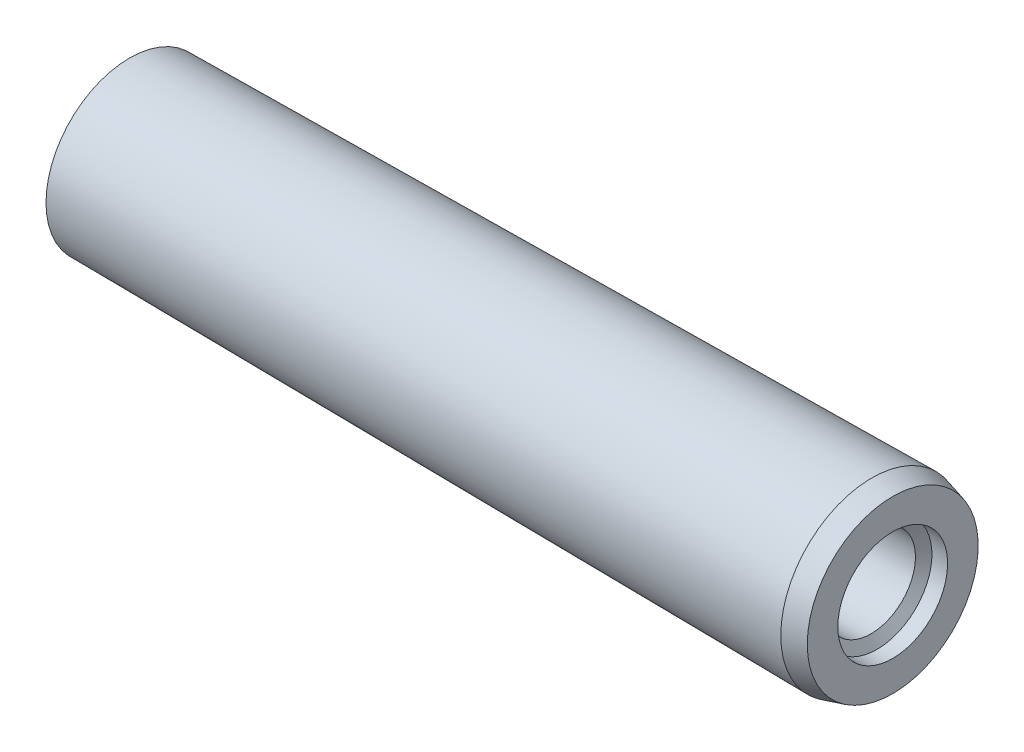
ISO-10303-21;
HEADER;
FILE_DESCRIPTION(('STEP AP214'),'2;1');
FILE_NAME('part.step','',(''),(''),'','','');
FILE_SCHEMA(('AUTOMOTIVE_DESIGN { 1 0 10303 214 1 1 1 1 }'));
ENDSEC;
DATA;
#1=APPLICATION_CONTEXT('core data for automotive mechanical design processes');
#2=APPLICATION_PROTOCOL_DEFINITION('international standard','automotive_design',2000,#1);
#3=PRODUCT_CONTEXT('',#1,'mechanical');
#4=PRODUCT('Part','Part','',(#3));
#5=PRODUCT_RELATED_PRODUCT_CATEGORY('part','',(#4));
#6=PRODUCT_DEFINITION_FORMATION('','',#4);
#7=PRODUCT_DEFINITION_CONTEXT('part definition',#1,'design');
#8=PRODUCT_DEFINITION('design','',#6,#7);
#9=PRODUCT_DEFINITION_SHAPE('','',#8);
#10=(LENGTH_UNIT() NAMED_UNIT(*) SI_UNIT(.MILLI.,.METRE.));
#11=(NAMED_UNIT(*) PLANE_ANGLE_UNIT() SI_UNIT($,.RADIAN.));
#12=(NAMED_UNIT(*) SI_UNIT($,.STERADIAN.) SOLID_ANGLE_UNIT());
#13=UNCERTAINTY_MEASURE_WITH_UNIT(LENGTH_MEASURE(1.E-05),#10,'distance_accuracy_value','');
#14=(GEOMETRIC_REPRESENTATION_CONTEXT(3) GLOBAL_UNCERTAINTY_ASSIGNED_CONTEXT((#13)) GLOBAL_UNIT_ASSIGNED_CONTEXT((#10,
#11,#12)) REPRESENTATION_CONTEXT('',''));
#15=CARTESIAN_POINT('',(0.,0.,0.));
#16=DIRECTION('',(0.,0.,1.));
#17=DIRECTION('',(1.,0.,0.));
#18=AXIS2_PLACEMENT_3D('',#15,#16,#17);
#19=CARTESIAN_POINT('',(75.,8.17410161429075,0.));
#20=DIRECTION('',(-1.,0.,0.));
#21=DIRECTION('',(0.,0.,1.));
#22=AXIS2_PLACEMENT_3D('',#19,#20,#21);
#23=PLANE('',#22);
#24=CARTESIAN_POINT('',(75.,0.,0.));
#25=DIRECTION('',(-1.,0.,0.));
#26=DIRECTION('',(0.,0.,1.));
#27=AXIS2_PLACEMENT_3D('',#24,#25,#26);
#28=CIRCLE('',#27,8.17410161429075);
#29=CARTESIAN_POINT('',(75.,0.,8.17410161429075));
#30=VERTEX_POINT('',#29);
#31=EDGE_CURVE('E11',#30,#30,#28,.T.);
#32=ORIENTED_EDGE('',*,*,#31,.F.);
#33=EDGE_LOOP('',(#32));
#34=FACE_BOUND('',#33,.T.);
#35=CARTESIAN_POINT('',(75.,0.,0.));
#36=DIRECTION('',(-1.,0.,0.));
#37=DIRECTION('',(0.,0.,1.));
#38=AXIS2_PLACEMENT_3D('',#35,#36,#37);
#39=CIRCLE('',#38,5.25);
#40=CARTESIAN_POINT('',(75.,0.,5.25));
#41=VERTEX_POINT('',#40);
#42=EDGE_CURVE('E71',#41,#41,#39,.T.);
#43=ORIENTED_EDGE('',*,*,#42,.T.);
#44=EDGE_LOOP('',(#43));
#45=FACE_BOUND('',#44,.T.);
#46=ADVANCED_FACE('F34',(#34,#45),#23,.F.);
#47=CARTESIAN_POINT('',(75.,0.,0.));
#48=DIRECTION('',(-1.,0.,0.));
#49=DIRECTION('',(0.,0.,1.));
#50=AXIS2_PLACEMENT_3D('',#47,#48,#49);
#51=CONICAL_SURFACE('',#50,8.17410161429075,0.261799387799146);
#52=CARTESIAN_POINT('',(73.,0.,0.));
#53=DIRECTION('',(-1.,0.,0.));
#54=DIRECTION('',(0.,0.,1.));
#55=AXIS2_PLACEMENT_3D('',#52,#53,#54);
#56=CIRCLE('',#55,8.70999999915299);
#57=CARTESIAN_POINT('',(73.,0.,8.70999999915299));
#58=VERTEX_POINT('',#57);
#59=EDGE_CURVE('E40',#58,#58,#56,.T.);
#60=ORIENTED_EDGE('',*,*,#59,.F.);
#61=EDGE_LOOP('',(#60));
#62=FACE_BOUND('',#61,.T.);
#63=ORIENTED_EDGE('',*,*,#31,.T.);
#64=EDGE_LOOP('',(#63));
#65=FACE_BOUND('',#64,.T.);
#66=ADVANCED_FACE('F61',(#62,#65),#51,.T.);
#67=CARTESIAN_POINT('',(73.,0.,0.));
#68=DIRECTION('',(1.,0.,0.));
#69=DIRECTION('',(0.,0.,-1.));
#70=AXIS2_PLACEMENT_3D('',#67,#68,#69);
#71=CONICAL_SURFACE('',#70,8.70999999915299,0.00999966667473665);
#72=CARTESIAN_POINT('',(2.,0.,0.));
#73=DIRECTION('',(-1.,0.,0.));
#74=DIRECTION('',(0.,0.,1.));
#75=AXIS2_PLACEMENT_3D('',#72,#73,#74);
#76=CIRCLE('',#75,8.);
#77=CARTESIAN_POINT('',(2.,0.,8.));
#78=VERTEX_POINT('',#77);
#79=EDGE_CURVE('E84',#78,#78,#76,.T.);
#80=ORIENTED_EDGE('',*,*,#79,.F.);
#81=EDGE_LOOP('',(#80));
#82=FACE_BOUND('',#81,.T.);
#83=ORIENTED_EDGE('',*,*,#59,.T.);
#84=EDGE_LOOP('',(#83));
#85=FACE_BOUND('',#84,.T.);
#86=ADVANCED_FACE('F56',(#82,#85),#71,.T.);
#87=CARTESIAN_POINT('',(17.,0.,0.));
#88=DIRECTION('',(-1.,0.,0.));
#89=DIRECTION('',(0.,1.,0.));
#90=AXIS2_PLACEMENT_3D('',#87,#88,#89);
#91=SPHERICAL_SURFACE('',#90,17.);
#92=ORIENTED_EDGE('',*,*,#79,.T.);
#93=EDGE_LOOP('',(#92));
#94=FACE_BOUND('',#93,.T.);
#95=ADVANCED_FACE('F46',(#94),#91,.T.);
#96=CARTESIAN_POINT('',(48.2395923599143,0.,0.));
#97=DIRECTION('',(1.,0.,0.));
#98=DIRECTION('',(0.,0.,-1.));
#99=AXIS2_PLACEMENT_3D('',#96,#97,#98);
#100=CONICAL_SURFACE('',#99,0.,1.17809724509617);
#101=CARTESIAN_POINT('',(50.,0.,0.));
#102=DIRECTION('',(-1.,0.,0.));
#103=DIRECTION('',(0.,0.,1.));
#104=AXIS2_PLACEMENT_3D('',#101,#102,#103);
#105=CIRCLE('',#104,4.25);
#106=CARTESIAN_POINT('',(50.,0.,4.25));
#107=VERTEX_POINT('',#106);
#108=EDGE_CURVE('E81',#107,#107,#105,.T.);
#109=ORIENTED_EDGE('',*,*,#108,.F.);
#110=EDGE_LOOP('',(#109));
#111=FACE_BOUND('',#110,.T.);
#112=CARTESIAN_POINT('',(48.2395923599143,0.,0.));
#113=VERTEX_POINT('',#112);
#114=VERTEX_LOOP('',#113);
#115=FACE_BOUND('',#114,.T.);
#116=ADVANCED_FACE('F43',(#111,#115),#100,.F.);
#117=CARTESIAN_POINT('',(0.,0.,0.));
#118=DIRECTION('',(-1.,0.,0.));
#119=DIRECTION('',(0.,0.,1.));
#120=AXIS2_PLACEMENT_3D('',#117,#118,#119);
#121=CYLINDRICAL_SURFACE('',#120,4.25);
#122=CARTESIAN_POINT('',(72.9226497308104,0.,0.));
#123=DIRECTION('',(-1.,0.,0.));
#124=DIRECTION('',(0.,0.,1.));
#125=AXIS2_PLACEMENT_3D('',#122,#123,#124);
#126=CIRCLE('',#125,4.25);
#127=CARTESIAN_POINT('',(72.9226497308104,0.,4.25));
#128=VERTEX_POINT('',#127);
#129=EDGE_CURVE('E76',#128,#128,#126,.T.);
#130=ORIENTED_EDGE('',*,*,#129,.F.);
#131=EDGE_LOOP('',(#130));
#132=FACE_BOUND('',#131,.T.);
#133=ORIENTED_EDGE('',*,*,#108,.T.);
#134=EDGE_LOOP('',(#133));
#135=FACE_BOUND('',#134,.T.);
#136=ADVANCED_FACE('F45',(#132,#135),#121,.F.);
#137=CARTESIAN_POINT('',(72.9226497308104,0.,0.));
#138=DIRECTION('',(1.,0.,0.));
#139=DIRECTION('',(0.,0.,-1.));
#140=AXIS2_PLACEMENT_3D('',#137,#138,#139);
#141=CONICAL_SURFACE('',#140,4.25,1.0471975511966);
#142=CARTESIAN_POINT('',(73.5,0.,0.));
#143=DIRECTION('',(-1.,0.,0.));
#144=DIRECTION('',(0.,0.,1.));
#145=AXIS2_PLACEMENT_3D('',#142,#143,#144);
#146=CIRCLE('',#145,5.25);
#147=CARTESIAN_POINT('',(73.5,0.,5.25));
#148=VERTEX_POINT('',#147);
#149=EDGE_CURVE('E73',#148,#148,#146,.T.);
#150=ORIENTED_EDGE('',*,*,#149,.F.);
#151=EDGE_LOOP('',(#150));
#152=FACE_BOUND('',#151,.T.);
#153=ORIENTED_EDGE('',*,*,#129,.T.);
#154=EDGE_LOOP('',(#153));
#155=FACE_BOUND('',#154,.T.);
#156=ADVANCED_FACE('F53',(#152,#155),#141,.F.);
#157=CARTESIAN_POINT('',(0.,0.,0.));
#158=DIRECTION('',(-1.,0.,0.));
#159=DIRECTION('',(0.,0.,1.));
#160=AXIS2_PLACEMENT_3D('',#157,#158,#159);
#161=CYLINDRICAL_SURFACE('',#160,5.25);
#162=ORIENTED_EDGE('',*,*,#42,.F.);
#163=EDGE_LOOP('',(#162));
#164=FACE_BOUND('',#163,.T.);
#165=ORIENTED_EDGE('',*,*,#149,.T.);
#166=EDGE_LOOP('',(#165));
#167=FACE_BOUND('',#166,.T.);
#168=ADVANCED_FACE('F122',(#164,#167),#161,.F.);
#169=CLOSED_SHELL('',(#46,#66,#86,#95,#116,#136,#156,#168));
#170=MANIFOLD_SOLID_BREP('B2',#169);
#171=ADVANCED_BREP_SHAPE_REPRESENTATION('',(#18,#170),#14);
#172=SHAPE_DEFINITION_REPRESENTATION(#9,#171);
ENDSEC;
END-ISO-10303-21;
